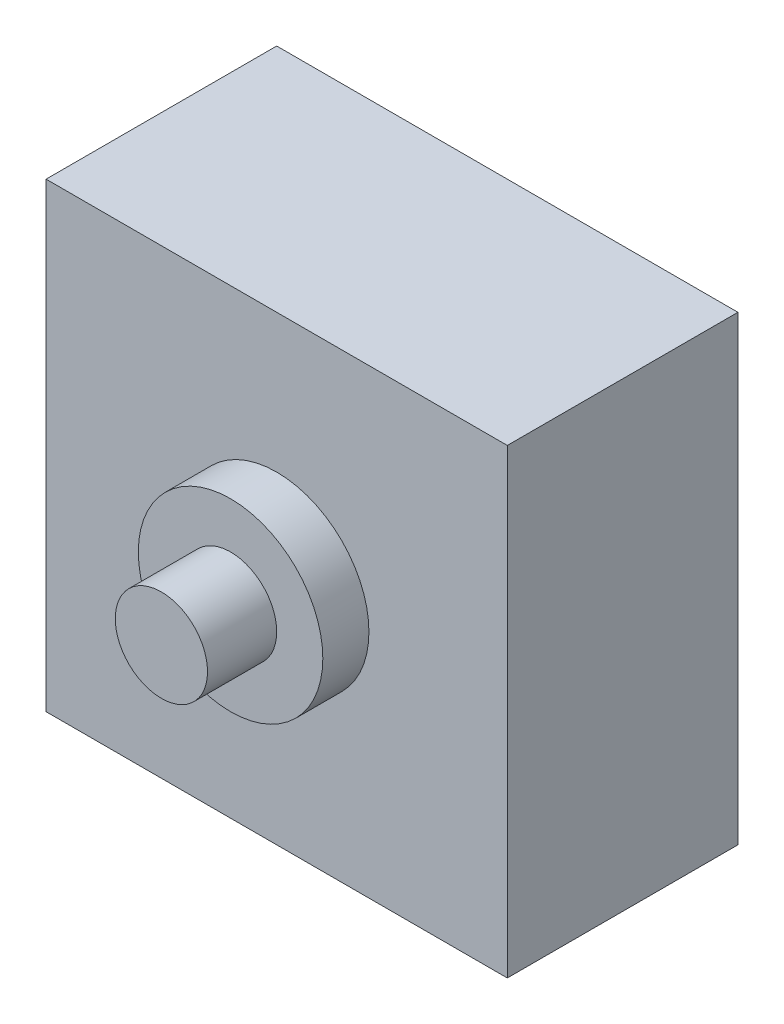
ISO-10303-21;
HEADER;
FILE_DESCRIPTION(('STEP AP214'),'2;1');
FILE_NAME('part.step','',(''),(''),'','','');
FILE_SCHEMA(('AUTOMOTIVE_DESIGN { 1 0 10303 214 1 1 1 1 }'));
ENDSEC;
DATA;
#1=APPLICATION_CONTEXT('core data for automotive mechanical design processes');
#2=APPLICATION_PROTOCOL_DEFINITION('international standard','automotive_design',2000,#1);
#3=PRODUCT_CONTEXT('',#1,'mechanical');
#4=PRODUCT('Part','Part','',(#3));
#5=PRODUCT_RELATED_PRODUCT_CATEGORY('part','',(#4));
#6=PRODUCT_DEFINITION_FORMATION('','',#4);
#7=PRODUCT_DEFINITION_CONTEXT('part definition',#1,'design');
#8=PRODUCT_DEFINITION('design','',#6,#7);
#9=PRODUCT_DEFINITION_SHAPE('','',#8);
#10=(LENGTH_UNIT() NAMED_UNIT(*) SI_UNIT(.MILLI.,.METRE.));
#11=(NAMED_UNIT(*) PLANE_ANGLE_UNIT() SI_UNIT($,.RADIAN.));
#12=(NAMED_UNIT(*) SI_UNIT($,.STERADIAN.) SOLID_ANGLE_UNIT());
#13=UNCERTAINTY_MEASURE_WITH_UNIT(LENGTH_MEASURE(1.E-05),#10,'distance_accuracy_value','');
#14=(GEOMETRIC_REPRESENTATION_CONTEXT(3) GLOBAL_UNCERTAINTY_ASSIGNED_CONTEXT((#13)) GLOBAL_UNIT_ASSIGNED_CONTEXT((#10,
#11,#12)) REPRESENTATION_CONTEXT('',''));
#15=CARTESIAN_POINT('',(0.,0.,0.));
#16=DIRECTION('',(0.,0.,1.));
#17=DIRECTION('',(1.,0.,0.));
#18=AXIS2_PLACEMENT_3D('',#15,#16,#17);
#19=CARTESIAN_POINT('',(100.,-100.,100.));
#20=DIRECTION('',(-1.,0.,0.));
#21=DIRECTION('',(0.,0.,1.));
#22=AXIS2_PLACEMENT_3D('',#19,#20,#21);
#23=PLANE('',#22);
#24=DIRECTION('',(0.,1.,0.));
#25=VECTOR('',#24,1.);
#26=CARTESIAN_POINT('',(100.,-100.,0.));
#27=LINE('',#26,#25);
#28=CARTESIAN_POINT('',(100.,-100.,0.));
#29=VERTEX_POINT('',#28);
#30=CARTESIAN_POINT('',(100.,100.,0.));
#31=VERTEX_POINT('',#30);
#32=EDGE_CURVE('E106',#29,#31,#27,.T.);
#33=ORIENTED_EDGE('',*,*,#32,.T.);
#34=DIRECTION('',(0.,0.,-1.));
#35=VECTOR('',#34,1.);
#36=CARTESIAN_POINT('',(100.,100.,100.));
#37=LINE('',#36,#35);
#38=CARTESIAN_POINT('',(100.,100.,100.));
#39=VERTEX_POINT('',#38);
#40=EDGE_CURVE('E45',#39,#31,#37,.T.);
#41=ORIENTED_EDGE('',*,*,#40,.F.);
#42=DIRECTION('',(0.,1.,0.));
#43=VECTOR('',#42,1.);
#44=CARTESIAN_POINT('',(100.,-100.,100.));
#45=LINE('',#44,#43);
#46=CARTESIAN_POINT('',(100.,-100.,100.));
#47=VERTEX_POINT('',#46);
#48=EDGE_CURVE('E91',#47,#39,#45,.T.);
#49=ORIENTED_EDGE('',*,*,#48,.F.);
#50=DIRECTION('',(0.,0.,-1.));
#51=VECTOR('',#50,1.);
#52=CARTESIAN_POINT('',(100.,-100.,100.));
#53=LINE('',#52,#51);
#54=EDGE_CURVE('E105',#47,#29,#53,.T.);
#55=ORIENTED_EDGE('',*,*,#54,.T.);
#56=EDGE_LOOP('',(#33,#41,#49,#55));
#57=FACE_BOUND('',#56,.T.);
#58=ADVANCED_FACE('F39',(#57),#23,.F.);
#59=CARTESIAN_POINT('',(-100.,100.,100.));
#60=DIRECTION('',(0.,-1.,0.));
#61=DIRECTION('',(0.,0.,-1.));
#62=AXIS2_PLACEMENT_3D('',#59,#60,#61);
#63=PLANE('',#62);
#64=DIRECTION('',(-1.,0.,0.));
#65=VECTOR('',#64,1.);
#66=CARTESIAN_POINT('',(-100.,100.,0.));
#67=LINE('',#66,#65);
#68=CARTESIAN_POINT('',(-100.,100.,0.));
#69=VERTEX_POINT('',#68);
#70=EDGE_CURVE('E98',#31,#69,#67,.T.);
#71=ORIENTED_EDGE('',*,*,#70,.T.);
#72=DIRECTION('',(0.,0.,-1.));
#73=VECTOR('',#72,1.);
#74=CARTESIAN_POINT('',(-100.,100.,100.));
#75=LINE('',#74,#73);
#76=CARTESIAN_POINT('',(-100.,100.,100.));
#77=VERTEX_POINT('',#76);
#78=EDGE_CURVE('E96',#77,#69,#75,.T.);
#79=ORIENTED_EDGE('',*,*,#78,.F.);
#80=DIRECTION('',(-1.,0.,0.));
#81=VECTOR('',#80,1.);
#82=CARTESIAN_POINT('',(-100.,100.,100.));
#83=LINE('',#82,#81);
#84=EDGE_CURVE('E86',#39,#77,#83,.T.);
#85=ORIENTED_EDGE('',*,*,#84,.F.);
#86=ORIENTED_EDGE('',*,*,#40,.T.);
#87=EDGE_LOOP('',(#71,#79,#85,#86));
#88=FACE_BOUND('',#87,.T.);
#89=ADVANCED_FACE('F100',(#88),#63,.F.);
#90=CARTESIAN_POINT('',(-100.,-100.,100.));
#91=DIRECTION('',(1.,0.,0.));
#92=DIRECTION('',(0.,0.,-1.));
#93=AXIS2_PLACEMENT_3D('',#90,#91,#92);
#94=PLANE('',#93);
#95=DIRECTION('',(0.,-1.,0.));
#96=VECTOR('',#95,1.);
#97=CARTESIAN_POINT('',(-100.,-100.,0.));
#98=LINE('',#97,#96);
#99=CARTESIAN_POINT('',(-100.,-100.,0.));
#100=VERTEX_POINT('',#99);
#101=EDGE_CURVE('E74',#69,#100,#98,.T.);
#102=ORIENTED_EDGE('',*,*,#101,.T.);
#103=DIRECTION('',(0.,0.,-1.));
#104=VECTOR('',#103,1.);
#105=CARTESIAN_POINT('',(-100.,-100.,100.));
#106=LINE('',#105,#104);
#107=CARTESIAN_POINT('',(-100.,-100.,100.));
#108=VERTEX_POINT('',#107);
#109=EDGE_CURVE('E97',#108,#100,#106,.T.);
#110=ORIENTED_EDGE('',*,*,#109,.F.);
#111=DIRECTION('',(0.,-1.,0.));
#112=VECTOR('',#111,1.);
#113=CARTESIAN_POINT('',(-100.,-100.,100.));
#114=LINE('',#113,#112);
#115=EDGE_CURVE('E93',#77,#108,#114,.T.);
#116=ORIENTED_EDGE('',*,*,#115,.F.);
#117=ORIENTED_EDGE('',*,*,#78,.T.);
#118=EDGE_LOOP('',(#102,#110,#116,#117));
#119=FACE_BOUND('',#118,.T.);
#120=ADVANCED_FACE('F99',(#119),#94,.F.);
#121=CARTESIAN_POINT('',(-100.,-100.,100.));
#122=DIRECTION('',(0.,1.,0.));
#123=DIRECTION('',(0.,0.,1.));
#124=AXIS2_PLACEMENT_3D('',#121,#122,#123);
#125=PLANE('',#124);
#126=DIRECTION('',(1.,0.,0.));
#127=VECTOR('',#126,1.);
#128=CARTESIAN_POINT('',(-100.,-100.,0.));
#129=LINE('',#128,#127);
#130=EDGE_CURVE('E76',#100,#29,#129,.T.);
#131=ORIENTED_EDGE('',*,*,#130,.T.);
#132=ORIENTED_EDGE('',*,*,#54,.F.);
#133=DIRECTION('',(1.,0.,0.));
#134=VECTOR('',#133,1.);
#135=CARTESIAN_POINT('',(-100.,-100.,100.));
#136=LINE('',#135,#134);
#137=EDGE_CURVE('E60',#108,#47,#136,.T.);
#138=ORIENTED_EDGE('',*,*,#137,.F.);
#139=ORIENTED_EDGE('',*,*,#109,.T.);
#140=EDGE_LOOP('',(#131,#132,#138,#139));
#141=FACE_BOUND('',#140,.T.);
#142=ADVANCED_FACE('F111',(#141),#125,.F.);
#143=CARTESIAN_POINT('',(0.,0.,100.));
#144=DIRECTION('',(0.,0.,-1.));
#145=DIRECTION('',(-1.,0.,0.));
#146=AXIS2_PLACEMENT_3D('',#143,#144,#145);
#147=PLANE('',#146);
#148=CARTESIAN_POINT('',(0.,0.,100.));
#149=DIRECTION('',(0.,0.,1.));
#150=DIRECTION('',(1.,0.,0.));
#151=AXIS2_PLACEMENT_3D('',#148,#149,#150);
#152=CIRCLE('',#151,40.);
#153=CARTESIAN_POINT('',(40.,0.,100.));
#154=VERTEX_POINT('',#153);
#155=EDGE_CURVE('E48',#154,#154,#152,.T.);
#156=ORIENTED_EDGE('',*,*,#155,.F.);
#157=EDGE_LOOP('',(#156));
#158=FACE_BOUND('',#157,.T.);
#159=ORIENTED_EDGE('',*,*,#48,.T.);
#160=ORIENTED_EDGE('',*,*,#84,.T.);
#161=ORIENTED_EDGE('',*,*,#115,.T.);
#162=ORIENTED_EDGE('',*,*,#137,.T.);
#163=EDGE_LOOP('',(#159,#160,#161,#162));
#164=FACE_BOUND('',#163,.T.);
#165=ADVANCED_FACE('F90',(#158,#164),#147,.F.);
#166=CARTESIAN_POINT('',(0.,0.,0.));
#167=DIRECTION('',(0.,0.,-1.));
#168=DIRECTION('',(-1.,0.,0.));
#169=AXIS2_PLACEMENT_3D('',#166,#167,#168);
#170=PLANE('',#169);
#171=ORIENTED_EDGE('',*,*,#32,.F.);
#172=ORIENTED_EDGE('',*,*,#130,.F.);
#173=ORIENTED_EDGE('',*,*,#101,.F.);
#174=ORIENTED_EDGE('',*,*,#70,.F.);
#175=EDGE_LOOP('',(#171,#172,#173,#174));
#176=FACE_BOUND('',#175,.T.);
#177=ADVANCED_FACE('F119',(#176),#170,.T.);
#178=CARTESIAN_POINT('',(0.,0.,120.));
#179=DIRECTION('',(0.,0.,-1.));
#180=DIRECTION('',(-1.,0.,0.));
#181=AXIS2_PLACEMENT_3D('',#178,#179,#180);
#182=CYLINDRICAL_SURFACE('',#181,40.);
#183=CARTESIAN_POINT('',(0.,0.,120.));
#184=DIRECTION('',(0.,0.,1.));
#185=DIRECTION('',(1.,0.,0.));
#186=AXIS2_PLACEMENT_3D('',#183,#184,#185);
#187=CIRCLE('',#186,40.);
#188=CARTESIAN_POINT('',(40.,0.,120.));
#189=VERTEX_POINT('',#188);
#190=EDGE_CURVE('E108',#189,#189,#187,.T.);
#191=ORIENTED_EDGE('',*,*,#190,.F.);
#192=EDGE_LOOP('',(#191));
#193=FACE_BOUND('',#192,.T.);
#194=ORIENTED_EDGE('',*,*,#155,.T.);
#195=EDGE_LOOP('',(#194));
#196=FACE_BOUND('',#195,.T.);
#197=ADVANCED_FACE('F138',(#193,#196),#182,.T.);
#198=CARTESIAN_POINT('',(0.,0.,120.));
#199=DIRECTION('',(0.,0.,1.));
#200=DIRECTION('',(1.,0.,0.));
#201=AXIS2_PLACEMENT_3D('',#198,#199,#200);
#202=PLANE('',#201);
#203=CARTESIAN_POINT('',(0.,0.,120.));
#204=DIRECTION('',(0.,0.,1.));
#205=DIRECTION('',(1.,0.,0.));
#206=AXIS2_PLACEMENT_3D('',#203,#204,#205);
#207=CIRCLE('',#206,20.);
#208=CARTESIAN_POINT('',(20.,0.,120.));
#209=VERTEX_POINT('',#208);
#210=EDGE_CURVE('E11',#209,#209,#207,.T.);
#211=ORIENTED_EDGE('',*,*,#210,.F.);
#212=EDGE_LOOP('',(#211));
#213=FACE_BOUND('',#212,.T.);
#214=ORIENTED_EDGE('',*,*,#190,.T.);
#215=EDGE_LOOP('',(#214));
#216=FACE_BOUND('',#215,.T.);
#217=ADVANCED_FACE('F132',(#213,#216),#202,.T.);
#218=CARTESIAN_POINT('',(0.,0.,150.));
#219=DIRECTION('',(0.,0.,-1.));
#220=DIRECTION('',(-1.,0.,0.));
#221=AXIS2_PLACEMENT_3D('',#218,#219,#220);
#222=CYLINDRICAL_SURFACE('',#221,20.);
#223=CARTESIAN_POINT('',(0.,0.,150.));
#224=DIRECTION('',(0.,0.,1.));
#225=DIRECTION('',(1.,0.,0.));
#226=AXIS2_PLACEMENT_3D('',#223,#224,#225);
#227=CIRCLE('',#226,20.);
#228=CARTESIAN_POINT('',(20.,0.,150.));
#229=VERTEX_POINT('',#228);
#230=EDGE_CURVE('E122',#229,#229,#227,.T.);
#231=ORIENTED_EDGE('',*,*,#230,.F.);
#232=EDGE_LOOP('',(#231));
#233=FACE_BOUND('',#232,.T.);
#234=ORIENTED_EDGE('',*,*,#210,.T.);
#235=EDGE_LOOP('',(#234));
#236=FACE_BOUND('',#235,.T.);
#237=ADVANCED_FACE('F128',(#233,#236),#222,.T.);
#238=CARTESIAN_POINT('',(0.,0.,150.));
#239=DIRECTION('',(0.,0.,1.));
#240=DIRECTION('',(1.,0.,0.));
#241=AXIS2_PLACEMENT_3D('',#238,#239,#240);
#242=PLANE('',#241);
#243=ORIENTED_EDGE('',*,*,#230,.T.);
#244=EDGE_LOOP('',(#243));
#245=FACE_BOUND('',#244,.T.);
#246=ADVANCED_FACE('F126',(#245),#242,.T.);
#247=CLOSED_SHELL('',(#58,#89,#120,#142,#165,#177,#197,#217,#237,#246));
#248=MANIFOLD_SOLID_BREP('B2',#247);
#249=ADVANCED_BREP_SHAPE_REPRESENTATION('',(#18,#248),#14);
#250=SHAPE_DEFINITION_REPRESENTATION(#9,#249);
ENDSEC;
END-ISO-10303-21;
